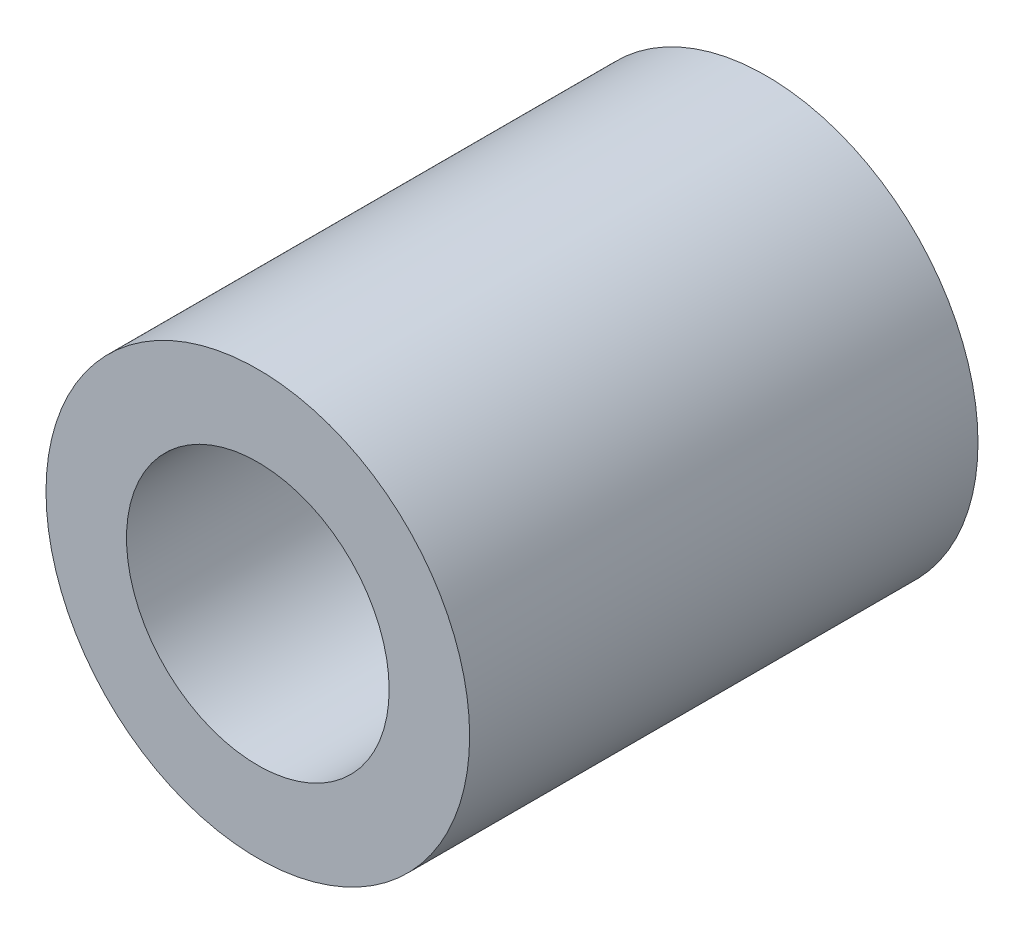
ISO-10303-21;
HEADER;
FILE_DESCRIPTION(('STEP AP214'),'2;1');
FILE_NAME('part.step','',(''),(''),'','','');
FILE_SCHEMA(('AUTOMOTIVE_DESIGN { 1 0 10303 214 1 1 1 1 }'));
ENDSEC;
DATA;
#1=APPLICATION_CONTEXT('core data for automotive mechanical design processes');
#2=APPLICATION_PROTOCOL_DEFINITION('international standard','automotive_design',2000,#1);
#3=PRODUCT_CONTEXT('',#1,'mechanical');
#4=PRODUCT('Part','Part','',(#3));
#5=PRODUCT_RELATED_PRODUCT_CATEGORY('part','',(#4));
#6=PRODUCT_DEFINITION_FORMATION('','',#4);
#7=PRODUCT_DEFINITION_CONTEXT('part definition',#1,'design');
#8=PRODUCT_DEFINITION('design','',#6,#7);
#9=PRODUCT_DEFINITION_SHAPE('','',#8);
#10=(LENGTH_UNIT() NAMED_UNIT(*) SI_UNIT(.MILLI.,.METRE.));
#11=(NAMED_UNIT(*) PLANE_ANGLE_UNIT() SI_UNIT($,.RADIAN.));
#12=(NAMED_UNIT(*) SI_UNIT($,.STERADIAN.) SOLID_ANGLE_UNIT());
#13=UNCERTAINTY_MEASURE_WITH_UNIT(LENGTH_MEASURE(1.E-05),#10,'distance_accuracy_value','');
#14=(GEOMETRIC_REPRESENTATION_CONTEXT(3) GLOBAL_UNCERTAINTY_ASSIGNED_CONTEXT((#13)) GLOBAL_UNIT_ASSIGNED_CONTEXT((#10,
#11,#12)) REPRESENTATION_CONTEXT('',''));
#15=CARTESIAN_POINT('',(0.,0.,0.));
#16=DIRECTION('',(0.,0.,1.));
#17=DIRECTION('',(1.,0.,0.));
#18=AXIS2_PLACEMENT_3D('',#15,#16,#17);
#19=CARTESIAN_POINT('',(-115.185656494873,88.5960411374072,6.));
#20=DIRECTION('',(0.,0.,1.));
#21=DIRECTION('',(1.,0.,0.));
#22=AXIS2_PLACEMENT_3D('',#19,#20,#21);
#23=PLANE('',#22);
#24=CARTESIAN_POINT('',(-115.185656494873,88.5960411374072,6.));
#25=DIRECTION('',(0.,0.,1.));
#26=DIRECTION('',(1.,0.,0.));
#27=AXIS2_PLACEMENT_3D('',#24,#25,#26);
#28=CIRCLE('',#27,2.5);
#29=CARTESIAN_POINT('',(-112.685656494873,88.5960411374072,6.));
#30=VERTEX_POINT('',#29);
#31=EDGE_CURVE('E10',#30,#30,#28,.T.);
#32=ORIENTED_EDGE('',*,*,#31,.T.);
#33=EDGE_LOOP('',(#32));
#34=FACE_BOUND('',#33,.T.);
#35=CARTESIAN_POINT('',(-115.185656494873,88.5960411374072,6.));
#36=DIRECTION('',(0.,0.,1.));
#37=DIRECTION('',(1.,0.,0.));
#38=AXIS2_PLACEMENT_3D('',#35,#36,#37);
#39=CIRCLE('',#38,1.54999999999999);
#40=CARTESIAN_POINT('',(-113.635656494873,88.5960411374072,6.));
#41=VERTEX_POINT('',#40);
#42=EDGE_CURVE('E44',#41,#41,#39,.T.);
#43=ORIENTED_EDGE('',*,*,#42,.F.);
#44=EDGE_LOOP('',(#43));
#45=FACE_BOUND('',#44,.T.);
#46=ADVANCED_FACE('F33',(#34,#45),#23,.T.);
#47=CARTESIAN_POINT('',(-115.185656494873,88.5960411374072,0.));
#48=DIRECTION('',(0.,0.,1.));
#49=DIRECTION('',(1.,0.,0.));
#50=AXIS2_PLACEMENT_3D('',#47,#48,#49);
#51=PLANE('',#50);
#52=CARTESIAN_POINT('',(-115.185656494873,88.5960411374072,0.));
#53=DIRECTION('',(0.,0.,1.));
#54=DIRECTION('',(1.,0.,0.));
#55=AXIS2_PLACEMENT_3D('',#52,#53,#54);
#56=CIRCLE('',#55,2.5);
#57=CARTESIAN_POINT('',(-112.685656494873,88.5960411374072,0.));
#58=VERTEX_POINT('',#57);
#59=EDGE_CURVE('E37',#58,#58,#56,.T.);
#60=ORIENTED_EDGE('',*,*,#59,.F.);
#61=EDGE_LOOP('',(#60));
#62=FACE_BOUND('',#61,.T.);
#63=CARTESIAN_POINT('',(-115.185656494873,88.5960411374072,0.));
#64=DIRECTION('',(0.,0.,1.));
#65=DIRECTION('',(1.,0.,0.));
#66=AXIS2_PLACEMENT_3D('',#63,#64,#65);
#67=CIRCLE('',#66,1.54999999999999);
#68=CARTESIAN_POINT('',(-113.635656494873,88.5960411374072,0.));
#69=VERTEX_POINT('',#68);
#70=EDGE_CURVE('E46',#69,#69,#67,.T.);
#71=ORIENTED_EDGE('',*,*,#70,.T.);
#72=EDGE_LOOP('',(#71));
#73=FACE_BOUND('',#72,.T.);
#74=ADVANCED_FACE('F56',(#62,#73),#51,.F.);
#75=CARTESIAN_POINT('',(-115.185656494873,88.5960411374072,6.));
#76=DIRECTION('',(0.,0.,-1.));
#77=DIRECTION('',(-1.,0.,0.));
#78=AXIS2_PLACEMENT_3D('',#75,#76,#77);
#79=CYLINDRICAL_SURFACE('',#78,2.5);
#80=ORIENTED_EDGE('',*,*,#31,.F.);
#81=EDGE_LOOP('',(#80));
#82=FACE_BOUND('',#81,.T.);
#83=ORIENTED_EDGE('',*,*,#59,.T.);
#84=EDGE_LOOP('',(#83));
#85=FACE_BOUND('',#84,.T.);
#86=ADVANCED_FACE('F35',(#82,#85),#79,.T.);
#87=CARTESIAN_POINT('',(-115.185656494873,88.5960411374072,6.));
#88=DIRECTION('',(0.,0.,-1.));
#89=DIRECTION('',(-1.,0.,0.));
#90=AXIS2_PLACEMENT_3D('',#87,#88,#89);
#91=CYLINDRICAL_SURFACE('',#90,1.54999999999999);
#92=ORIENTED_EDGE('',*,*,#42,.T.);
#93=EDGE_LOOP('',(#92));
#94=FACE_BOUND('',#93,.T.);
#95=ORIENTED_EDGE('',*,*,#70,.F.);
#96=EDGE_LOOP('',(#95));
#97=FACE_BOUND('',#96,.T.);
#98=ADVANCED_FACE('F52',(#94,#97),#91,.F.);
#99=CLOSED_SHELL('',(#46,#74,#86,#98));
#100=MANIFOLD_SOLID_BREP('B2',#99);
#101=ADVANCED_BREP_SHAPE_REPRESENTATION('',(#18,#100),#14);
#102=SHAPE_DEFINITION_REPRESENTATION(#9,#101);
ENDSEC;
END-ISO-10303-21;
